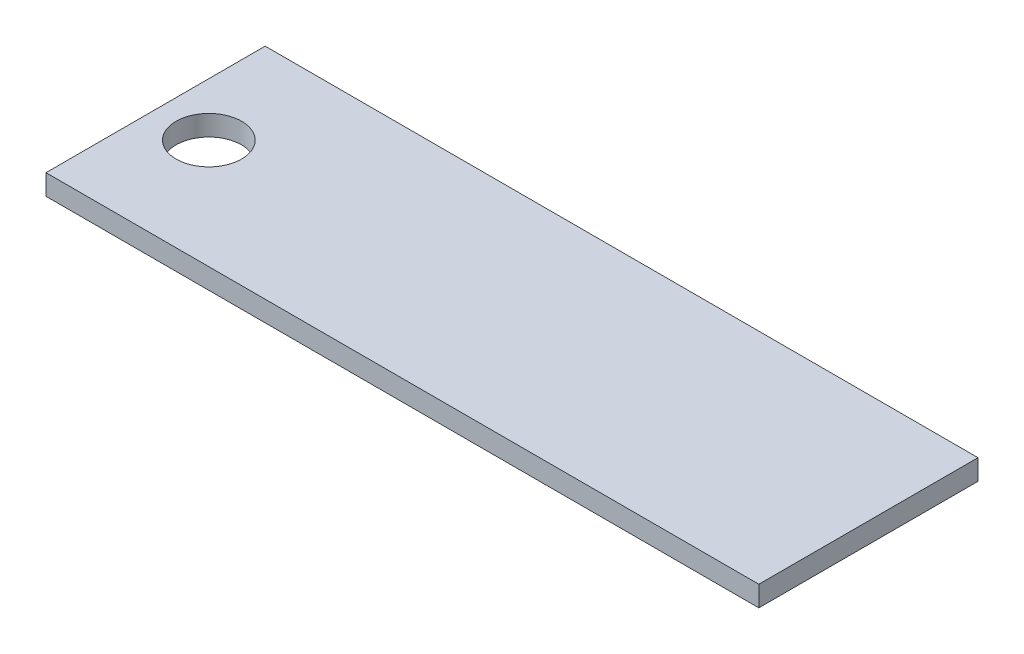
ISO-10303-21;
HEADER;
FILE_DESCRIPTION(('STEP AP214'),'2;1');
FILE_NAME('part.step','',(''),(''),'','','');
FILE_SCHEMA(('AUTOMOTIVE_DESIGN { 1 0 10303 214 1 1 1 1 }'));
ENDSEC;
DATA;
#1=APPLICATION_CONTEXT('core data for automotive mechanical design processes');
#2=APPLICATION_PROTOCOL_DEFINITION('international standard','automotive_design',2000,#1);
#3=PRODUCT_CONTEXT('',#1,'mechanical');
#4=PRODUCT('Part','Part','',(#3));
#5=PRODUCT_RELATED_PRODUCT_CATEGORY('part','',(#4));
#6=PRODUCT_DEFINITION_FORMATION('','',#4);
#7=PRODUCT_DEFINITION_CONTEXT('part definition',#1,'design');
#8=PRODUCT_DEFINITION('design','',#6,#7);
#9=PRODUCT_DEFINITION_SHAPE('','',#8);
#10=(LENGTH_UNIT() NAMED_UNIT(*) SI_UNIT(.MILLI.,.METRE.));
#11=(NAMED_UNIT(*) PLANE_ANGLE_UNIT() SI_UNIT($,.RADIAN.));
#12=(NAMED_UNIT(*) SI_UNIT($,.STERADIAN.) SOLID_ANGLE_UNIT());
#13=UNCERTAINTY_MEASURE_WITH_UNIT(LENGTH_MEASURE(1.E-05),#10,'distance_accuracy_value','');
#14=(GEOMETRIC_REPRESENTATION_CONTEXT(3) GLOBAL_UNCERTAINTY_ASSIGNED_CONTEXT((#13)) GLOBAL_UNIT_ASSIGNED_CONTEXT((#10,
#11,#12)) REPRESENTATION_CONTEXT('',''));
#15=CARTESIAN_POINT('',(0.,0.,0.));
#16=DIRECTION('',(0.,0.,1.));
#17=DIRECTION('',(1.,0.,0.));
#18=AXIS2_PLACEMENT_3D('',#15,#16,#17);
#19=CARTESIAN_POINT('',(0.,1.,-10.7));
#20=DIRECTION('',(0.,-1.,0.));
#21=DIRECTION('',(0.,0.,-1.));
#22=AXIS2_PLACEMENT_3D('',#19,#20,#21);
#23=PLANE('',#22);
#24=DIRECTION('',(0.,0.,1.));
#25=VECTOR('',#24,1.);
#26=CARTESIAN_POINT('',(0.,1.,0.));
#27=LINE('',#26,#25);
#28=CARTESIAN_POINT('',(0.,1.,-10.7));
#29=VERTEX_POINT('',#28);
#30=CARTESIAN_POINT('',(0.,1.,0.));
#31=VERTEX_POINT('',#30);
#32=EDGE_CURVE('E88',#29,#31,#27,.T.);
#33=ORIENTED_EDGE('',*,*,#32,.T.);
#34=DIRECTION('',(1.,0.,0.));
#35=VECTOR('',#34,1.);
#36=CARTESIAN_POINT('',(0.,1.,0.));
#37=LINE('',#36,#35);
#38=CARTESIAN_POINT('',(34.8,1.,0.));
#39=VERTEX_POINT('',#38);
#40=EDGE_CURVE('E83',#31,#39,#37,.T.);
#41=ORIENTED_EDGE('',*,*,#40,.T.);
#42=DIRECTION('',(0.,0.,-1.));
#43=VECTOR('',#42,1.);
#44=CARTESIAN_POINT('',(34.8,1.,0.));
#45=LINE('',#44,#43);
#46=CARTESIAN_POINT('',(34.8,1.,-10.7));
#47=VERTEX_POINT('',#46);
#48=EDGE_CURVE('E86',#39,#47,#45,.T.);
#49=ORIENTED_EDGE('',*,*,#48,.T.);
#50=DIRECTION('',(-1.,0.,0.));
#51=VECTOR('',#50,1.);
#52=CARTESIAN_POINT('',(0.,1.,-10.7));
#53=LINE('',#52,#51);
#54=EDGE_CURVE('E53',#47,#29,#53,.T.);
#55=ORIENTED_EDGE('',*,*,#54,.T.);
#56=EDGE_LOOP('',(#33,#41,#49,#55));
#57=FACE_BOUND('',#56,.T.);
#58=CARTESIAN_POINT('',(2.6,1.,-5.35));
#59=DIRECTION('',(0.,1.,0.));
#60=DIRECTION('',(0.,0.,1.));
#61=AXIS2_PLACEMENT_3D('',#58,#59,#60);
#62=CIRCLE('',#61,1.6);
#63=CARTESIAN_POINT('',(2.6,1.,-3.75));
#64=VERTEX_POINT('',#63);
#65=EDGE_CURVE('E103',#64,#64,#62,.T.);
#66=ORIENTED_EDGE('',*,*,#65,.F.);
#67=EDGE_LOOP('',(#66));
#68=FACE_BOUND('',#67,.T.);
#69=ADVANCED_FACE('F36',(#57,#68),#23,.F.);
#70=CARTESIAN_POINT('',(0.,0.,-10.7));
#71=DIRECTION('',(0.,-1.,0.));
#72=DIRECTION('',(0.,0.,-1.));
#73=AXIS2_PLACEMENT_3D('',#70,#71,#72);
#74=PLANE('',#73);
#75=DIRECTION('',(0.,0.,1.));
#76=VECTOR('',#75,1.);
#77=CARTESIAN_POINT('',(0.,0.,0.));
#78=LINE('',#77,#76);
#79=CARTESIAN_POINT('',(0.,0.,-10.7));
#80=VERTEX_POINT('',#79);
#81=CARTESIAN_POINT('',(0.,0.,0.));
#82=VERTEX_POINT('',#81);
#83=EDGE_CURVE('E100',#80,#82,#78,.T.);
#84=ORIENTED_EDGE('',*,*,#83,.F.);
#85=DIRECTION('',(-1.,0.,0.));
#86=VECTOR('',#85,1.);
#87=CARTESIAN_POINT('',(0.,0.,-10.7));
#88=LINE('',#87,#86);
#89=CARTESIAN_POINT('',(34.8,0.,-10.7));
#90=VERTEX_POINT('',#89);
#91=EDGE_CURVE('E76',#90,#80,#88,.T.);
#92=ORIENTED_EDGE('',*,*,#91,.F.);
#93=DIRECTION('',(0.,0.,-1.));
#94=VECTOR('',#93,1.);
#95=CARTESIAN_POINT('',(34.8,0.,0.));
#96=LINE('',#95,#94);
#97=CARTESIAN_POINT('',(34.8,0.,0.));
#98=VERTEX_POINT('',#97);
#99=EDGE_CURVE('E70',#98,#90,#96,.T.);
#100=ORIENTED_EDGE('',*,*,#99,.F.);
#101=DIRECTION('',(1.,0.,0.));
#102=VECTOR('',#101,1.);
#103=CARTESIAN_POINT('',(0.,0.,0.));
#104=LINE('',#103,#102);
#105=EDGE_CURVE('E92',#82,#98,#104,.T.);
#106=ORIENTED_EDGE('',*,*,#105,.F.);
#107=EDGE_LOOP('',(#84,#92,#100,#106));
#108=FACE_BOUND('',#107,.T.);
#109=CARTESIAN_POINT('',(2.6,0.,-5.35));
#110=DIRECTION('',(0.,1.,0.));
#111=DIRECTION('',(0.,0.,1.));
#112=AXIS2_PLACEMENT_3D('',#109,#110,#111);
#113=CIRCLE('',#112,1.6);
#114=CARTESIAN_POINT('',(2.6,0.,-3.75));
#115=VERTEX_POINT('',#114);
#116=EDGE_CURVE('E115',#115,#115,#113,.T.);
#117=ORIENTED_EDGE('',*,*,#116,.T.);
#118=EDGE_LOOP('',(#117));
#119=FACE_BOUND('',#118,.T.);
#120=ADVANCED_FACE('F111',(#108,#119),#74,.T.);
#121=CARTESIAN_POINT('',(0.,1.,0.));
#122=DIRECTION('',(1.,0.,0.));
#123=DIRECTION('',(0.,0.,-1.));
#124=AXIS2_PLACEMENT_3D('',#121,#122,#123);
#125=PLANE('',#124);
#126=ORIENTED_EDGE('',*,*,#83,.T.);
#127=DIRECTION('',(0.,-1.,0.));
#128=VECTOR('',#127,1.);
#129=CARTESIAN_POINT('',(0.,1.,0.));
#130=LINE('',#129,#128);
#131=EDGE_CURVE('E11',#31,#82,#130,.T.);
#132=ORIENTED_EDGE('',*,*,#131,.F.);
#133=ORIENTED_EDGE('',*,*,#32,.F.);
#134=DIRECTION('',(0.,-1.,0.));
#135=VECTOR('',#134,1.);
#136=CARTESIAN_POINT('',(0.,1.,-10.7));
#137=LINE('',#136,#135);
#138=EDGE_CURVE('E96',#29,#80,#137,.T.);
#139=ORIENTED_EDGE('',*,*,#138,.T.);
#140=EDGE_LOOP('',(#126,#132,#133,#139));
#141=FACE_BOUND('',#140,.T.);
#142=ADVANCED_FACE('F38',(#141),#125,.F.);
#143=CARTESIAN_POINT('',(0.,1.,0.));
#144=DIRECTION('',(0.,0.,-1.));
#145=DIRECTION('',(-1.,0.,0.));
#146=AXIS2_PLACEMENT_3D('',#143,#144,#145);
#147=PLANE('',#146);
#148=ORIENTED_EDGE('',*,*,#105,.T.);
#149=DIRECTION('',(0.,-1.,0.));
#150=VECTOR('',#149,1.);
#151=CARTESIAN_POINT('',(34.8,1.,0.));
#152=LINE('',#151,#150);
#153=EDGE_CURVE('E45',#39,#98,#152,.T.);
#154=ORIENTED_EDGE('',*,*,#153,.F.);
#155=ORIENTED_EDGE('',*,*,#40,.F.);
#156=ORIENTED_EDGE('',*,*,#131,.T.);
#157=EDGE_LOOP('',(#148,#154,#155,#156));
#158=FACE_BOUND('',#157,.T.);
#159=ADVANCED_FACE('F91',(#158),#147,.F.);
#160=CARTESIAN_POINT('',(34.8,1.,0.));
#161=DIRECTION('',(-1.,0.,0.));
#162=DIRECTION('',(0.,0.,1.));
#163=AXIS2_PLACEMENT_3D('',#160,#161,#162);
#164=PLANE('',#163);
#165=ORIENTED_EDGE('',*,*,#99,.T.);
#166=DIRECTION('',(0.,-1.,0.));
#167=VECTOR('',#166,1.);
#168=CARTESIAN_POINT('',(34.8,1.,-10.7));
#169=LINE('',#168,#167);
#170=EDGE_CURVE('E93',#47,#90,#169,.T.);
#171=ORIENTED_EDGE('',*,*,#170,.F.);
#172=ORIENTED_EDGE('',*,*,#48,.F.);
#173=ORIENTED_EDGE('',*,*,#153,.T.);
#174=EDGE_LOOP('',(#165,#171,#172,#173));
#175=FACE_BOUND('',#174,.T.);
#176=ADVANCED_FACE('F94',(#175),#164,.F.);
#177=CARTESIAN_POINT('',(0.,1.,-10.7));
#178=DIRECTION('',(0.,0.,1.));
#179=DIRECTION('',(1.,0.,0.));
#180=AXIS2_PLACEMENT_3D('',#177,#178,#179);
#181=PLANE('',#180);
#182=ORIENTED_EDGE('',*,*,#91,.T.);
#183=ORIENTED_EDGE('',*,*,#138,.F.);
#184=ORIENTED_EDGE('',*,*,#54,.F.);
#185=ORIENTED_EDGE('',*,*,#170,.T.);
#186=EDGE_LOOP('',(#182,#183,#184,#185));
#187=FACE_BOUND('',#186,.T.);
#188=ADVANCED_FACE('F108',(#187),#181,.F.);
#189=CARTESIAN_POINT('',(2.6,1.,-5.35));
#190=DIRECTION('',(0.,-1.,0.));
#191=DIRECTION('',(0.,0.,-1.));
#192=AXIS2_PLACEMENT_3D('',#189,#190,#191);
#193=CYLINDRICAL_SURFACE('',#192,1.6);
#194=ORIENTED_EDGE('',*,*,#65,.T.);
#195=EDGE_LOOP('',(#194));
#196=FACE_BOUND('',#195,.T.);
#197=ORIENTED_EDGE('',*,*,#116,.F.);
#198=EDGE_LOOP('',(#197));
#199=FACE_BOUND('',#198,.T.);
#200=ADVANCED_FACE('F121',(#196,#199),#193,.F.);
#201=CLOSED_SHELL('',(#69,#120,#142,#159,#176,#188,#200));
#202=MANIFOLD_SOLID_BREP('B2',#201);
#203=ADVANCED_BREP_SHAPE_REPRESENTATION('',(#18,#202),#14);
#204=SHAPE_DEFINITION_REPRESENTATION(#9,#203);
ENDSEC;
END-ISO-10303-21;
